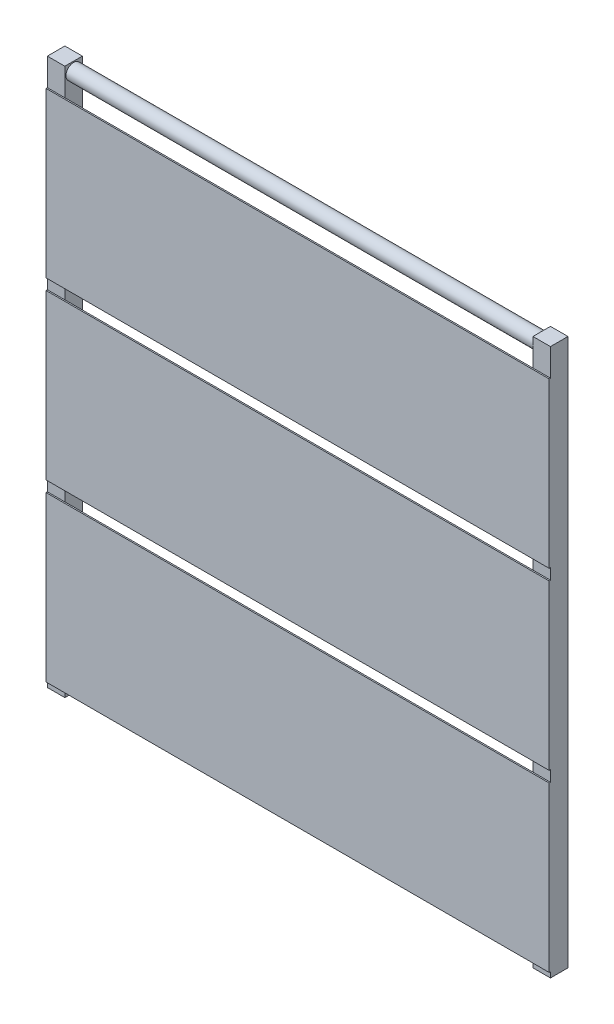
ISO-10303-21;
HEADER;
FILE_DESCRIPTION(('STEP AP214'),'2;1');
FILE_NAME('part.step','',(''),(''),'','','');
FILE_SCHEMA(('AUTOMOTIVE_DESIGN { 1 0 10303 214 1 1 1 1 }'));
ENDSEC;
DATA;
#1=APPLICATION_CONTEXT('core data for automotive mechanical design processes');
#2=APPLICATION_PROTOCOL_DEFINITION('international standard','automotive_design',2000,#1);
#3=PRODUCT_CONTEXT('',#1,'mechanical');
#4=PRODUCT('Part','Part','',(#3));
#5=PRODUCT_RELATED_PRODUCT_CATEGORY('part','',(#4));
#6=PRODUCT_DEFINITION_FORMATION('','',#4);
#7=PRODUCT_DEFINITION_CONTEXT('part definition',#1,'design');
#8=PRODUCT_DEFINITION('design','',#6,#7);
#9=PRODUCT_DEFINITION_SHAPE('','',#8);
#10=(LENGTH_UNIT() NAMED_UNIT(*) SI_UNIT(.MILLI.,.METRE.));
#11=(NAMED_UNIT(*) PLANE_ANGLE_UNIT() SI_UNIT($,.RADIAN.));
#12=(NAMED_UNIT(*) SI_UNIT($,.STERADIAN.) SOLID_ANGLE_UNIT());
#13=UNCERTAINTY_MEASURE_WITH_UNIT(LENGTH_MEASURE(1.E-05),#10,'distance_accuracy_value','');
#14=(GEOMETRIC_REPRESENTATION_CONTEXT(3) GLOBAL_UNCERTAINTY_ASSIGNED_CONTEXT((#13)) GLOBAL_UNIT_ASSIGNED_CONTEXT((#10,
#11,#12)) REPRESENTATION_CONTEXT('',''));
#15=CARTESIAN_POINT('',(0.,0.,0.));
#16=DIRECTION('',(0.,0.,1.));
#17=DIRECTION('',(1.,0.,0.));
#18=AXIS2_PLACEMENT_3D('',#15,#16,#17);
#19=CARTESIAN_POINT('',(-230.,250.,9.70000000000003));
#20=DIRECTION('',(0.,0.,-1.));
#21=DIRECTION('',(-1.,0.,0.));
#22=AXIS2_PLACEMENT_3D('',#19,#20,#21);
#23=PLANE('',#22);
#24=DIRECTION('',(1.,0.,0.));
#25=VECTOR('',#24,1.);
#26=CARTESIAN_POINT('',(-229.999999999997,-245.,9.70000000000003));
#27=LINE('',#26,#25);
#28=CARTESIAN_POINT('',(-229.999999999997,-245.,9.70000000000003));
#29=VERTEX_POINT('',#28);
#30=CARTESIAN_POINT('',(-214.,-245.,9.70000000000003));
#31=VERTEX_POINT('',#30);
#32=EDGE_CURVE('E577',#29,#31,#27,.T.);
#33=ORIENTED_EDGE('',*,*,#32,.F.);
#34=DIRECTION('',(0.,-1.,0.));
#35=VECTOR('',#34,1.);
#36=CARTESIAN_POINT('',(-230.,250.,9.70000000000003));
#37=LINE('',#36,#35);
#38=CARTESIAN_POINT('',(-230.,-250.,9.70000000000003));
#39=VERTEX_POINT('',#38);
#40=EDGE_CURVE('E417',#29,#39,#37,.T.);
#41=ORIENTED_EDGE('',*,*,#40,.T.);
#42=DIRECTION('',(1.,0.,0.));
#43=VECTOR('',#42,1.);
#44=CARTESIAN_POINT('',(-230.,-250.,9.70000000000003));
#45=LINE('',#44,#43);
#46=CARTESIAN_POINT('',(-214.,-250.,9.70000000000003));
#47=VERTEX_POINT('',#46);
#48=EDGE_CURVE('E392',#39,#47,#45,.T.);
#49=ORIENTED_EDGE('',*,*,#48,.T.);
#50=DIRECTION('',(0.,-1.,0.));
#51=VECTOR('',#50,1.);
#52=CARTESIAN_POINT('',(-214.,250.,9.70000000000003));
#53=LINE('',#52,#51);
#54=EDGE_CURVE('E55',#31,#47,#53,.T.);
#55=ORIENTED_EDGE('',*,*,#54,.F.);
#56=EDGE_LOOP('',(#33,#41,#49,#55));
#57=FACE_BOUND('',#56,.T.);
#58=ADVANCED_FACE('F39',(#57),#23,.F.);
#59=DIRECTION('',(-1.,0.,0.));
#60=VECTOR('',#59,1.);
#61=CARTESIAN_POINT('',(-229.999999999997,-95.,9.70000000000003));
#62=LINE('',#61,#60);
#63=CARTESIAN_POINT('',(-214.,-95.,9.70000000000003));
#64=VERTEX_POINT('',#63);
#65=CARTESIAN_POINT('',(-230.,-95.,9.70000000000003));
#66=VERTEX_POINT('',#65);
#67=EDGE_CURVE('E63',#64,#66,#62,.T.);
#68=ORIENTED_EDGE('',*,*,#67,.F.);
#69=CARTESIAN_POINT('',(-214.,-85.,9.70000000000003));
#70=VERTEX_POINT('',#69);
#71=EDGE_CURVE('E527',#70,#64,#53,.T.);
#72=ORIENTED_EDGE('',*,*,#71,.F.);
#73=DIRECTION('',(1.,0.,0.));
#74=VECTOR('',#73,1.);
#75=CARTESIAN_POINT('',(-229.999999999998,-85.,9.70000000000003));
#76=LINE('',#75,#74);
#77=CARTESIAN_POINT('',(-229.999999999998,-85.,9.70000000000003));
#78=VERTEX_POINT('',#77);
#79=EDGE_CURVE('E271',#78,#70,#76,.T.);
#80=ORIENTED_EDGE('',*,*,#79,.F.);
#81=EDGE_CURVE('E535',#78,#66,#37,.T.);
#82=ORIENTED_EDGE('',*,*,#81,.T.);
#83=EDGE_LOOP('',(#68,#72,#80,#82));
#84=FACE_BOUND('',#83,.T.);
#85=ADVANCED_FACE('F595',(#84),#23,.F.);
#86=CARTESIAN_POINT('',(230.,250.,9.69999999999992));
#87=DIRECTION('',(0.,0.,-1.));
#88=DIRECTION('',(-1.,0.,0.));
#89=AXIS2_PLACEMENT_3D('',#86,#87,#88);
#90=PLANE('',#89);
#91=CARTESIAN_POINT('',(214.,-245.,9.70000000000003));
#92=VERTEX_POINT('',#91);
#93=CARTESIAN_POINT('',(230.,-245.,9.69999999999992));
#94=VERTEX_POINT('',#93);
#95=EDGE_CURVE('E244',#92,#94,#27,.T.);
#96=ORIENTED_EDGE('',*,*,#95,.F.);
#97=DIRECTION('',(0.,-1.,0.));
#98=VECTOR('',#97,1.);
#99=CARTESIAN_POINT('',(214.,250.,9.69999999999992));
#100=LINE('',#99,#98);
#101=CARTESIAN_POINT('',(214.,-250.,9.69999999999992));
#102=VERTEX_POINT('',#101);
#103=EDGE_CURVE('E333',#92,#102,#100,.T.);
#104=ORIENTED_EDGE('',*,*,#103,.T.);
#105=DIRECTION('',(1.,0.,0.));
#106=VECTOR('',#105,1.);
#107=CARTESIAN_POINT('',(230.,-250.,9.69999999999992));
#108=LINE('',#107,#106);
#109=CARTESIAN_POINT('',(230.,-250.,9.69999999999992));
#110=VERTEX_POINT('',#109);
#111=EDGE_CURVE('E306',#102,#110,#108,.T.);
#112=ORIENTED_EDGE('',*,*,#111,.T.);
#113=DIRECTION('',(0.,-1.,0.));
#114=VECTOR('',#113,1.);
#115=CARTESIAN_POINT('',(230.,250.,9.69999999999992));
#116=LINE('',#115,#114);
#117=EDGE_CURVE('E315',#94,#110,#116,.T.);
#118=ORIENTED_EDGE('',*,*,#117,.F.);
#119=EDGE_LOOP('',(#96,#104,#112,#118));
#120=FACE_BOUND('',#119,.T.);
#121=ADVANCED_FACE('F454',(#120),#90,.F.);
#122=CARTESIAN_POINT('',(230.,-95.,9.69999999999992));
#123=VERTEX_POINT('',#122);
#124=CARTESIAN_POINT('',(214.,-95.,9.69999999999992));
#125=VERTEX_POINT('',#124);
#126=EDGE_CURVE('E237',#123,#125,#62,.T.);
#127=ORIENTED_EDGE('',*,*,#126,.F.);
#128=CARTESIAN_POINT('',(230.,-85.,9.69999999999992));
#129=VERTEX_POINT('',#128);
#130=EDGE_CURVE('E495',#129,#123,#116,.T.);
#131=ORIENTED_EDGE('',*,*,#130,.F.);
#132=CARTESIAN_POINT('',(214.,-85.,9.70000000000003));
#133=VERTEX_POINT('',#132);
#134=EDGE_CURVE('E250',#133,#129,#76,.T.);
#135=ORIENTED_EDGE('',*,*,#134,.F.);
#136=EDGE_CURVE('E459',#133,#125,#100,.T.);
#137=ORIENTED_EDGE('',*,*,#136,.T.);
#138=EDGE_LOOP('',(#127,#131,#135,#137));
#139=FACE_BOUND('',#138,.T.);
#140=ADVANCED_FACE('F566',(#139),#90,.F.);
#141=DIRECTION('',(-1.,0.,0.));
#142=VECTOR('',#141,1.);
#143=CARTESIAN_POINT('',(-229.999999999998,65.,9.70000000000003));
#144=LINE('',#143,#142);
#145=CARTESIAN_POINT('',(-214.,65.,9.70000000000003));
#146=VERTEX_POINT('',#145);
#147=CARTESIAN_POINT('',(-230.,65.,9.70000000000003));
#148=VERTEX_POINT('',#147);
#149=EDGE_CURVE('E275',#146,#148,#144,.T.);
#150=ORIENTED_EDGE('',*,*,#149,.F.);
#151=CARTESIAN_POINT('',(-214.,75.,9.70000000000003));
#152=VERTEX_POINT('',#151);
#153=EDGE_CURVE('E529',#152,#146,#53,.T.);
#154=ORIENTED_EDGE('',*,*,#153,.F.);
#155=DIRECTION('',(1.,0.,0.));
#156=VECTOR('',#155,1.);
#157=CARTESIAN_POINT('',(-230.,75.,9.70000000000003));
#158=LINE('',#157,#156);
#159=CARTESIAN_POINT('',(-230.,75.,9.70000000000003));
#160=VERTEX_POINT('',#159);
#161=EDGE_CURVE('E354',#160,#152,#158,.T.);
#162=ORIENTED_EDGE('',*,*,#161,.F.);
#163=EDGE_CURVE('E423',#160,#148,#37,.T.);
#164=ORIENTED_EDGE('',*,*,#163,.T.);
#165=EDGE_LOOP('',(#150,#154,#162,#164));
#166=FACE_BOUND('',#165,.T.);
#167=ADVANCED_FACE('F553',(#166),#23,.F.);
#168=CARTESIAN_POINT('',(230.,65.,9.69999999999992));
#169=VERTEX_POINT('',#168);
#170=CARTESIAN_POINT('',(214.,65.,9.69999999999992));
#171=VERTEX_POINT('',#170);
#172=EDGE_CURVE('E261',#169,#171,#144,.T.);
#173=ORIENTED_EDGE('',*,*,#172,.F.);
#174=CARTESIAN_POINT('',(230.,75.,9.70000000000003));
#175=VERTEX_POINT('',#174);
#176=EDGE_CURVE('E334',#175,#169,#116,.T.);
#177=ORIENTED_EDGE('',*,*,#176,.F.);
#178=CARTESIAN_POINT('',(214.,75.,9.70000000000003));
#179=VERTEX_POINT('',#178);
#180=EDGE_CURVE('E367',#179,#175,#158,.T.);
#181=ORIENTED_EDGE('',*,*,#180,.F.);
#182=EDGE_CURVE('E340',#179,#171,#100,.T.);
#183=ORIENTED_EDGE('',*,*,#182,.T.);
#184=EDGE_LOOP('',(#173,#177,#181,#183));
#185=FACE_BOUND('',#184,.T.);
#186=ADVANCED_FACE('F479',(#185),#90,.F.);
#187=CARTESIAN_POINT('',(0.,0.,9.70000000000003));
#188=DIRECTION('',(0.,0.,1.));
#189=DIRECTION('',(1.,0.,0.));
#190=AXIS2_PLACEMENT_3D('',#187,#188,#189);
#191=PLANE('',#190);
#192=DIRECTION('',(0.,1.,0.));
#193=VECTOR('',#192,1.);
#194=CARTESIAN_POINT('',(214.,0.,9.70000000000003));
#195=LINE('',#194,#193);
#196=CARTESIAN_POINT('',(214.,225.,9.69999999999992));
#197=VERTEX_POINT('',#196);
#198=EDGE_CURVE('E431',#179,#197,#195,.T.);
#199=ORIENTED_EDGE('',*,*,#198,.F.);
#200=EDGE_CURVE('E372',#152,#179,#158,.T.);
#201=ORIENTED_EDGE('',*,*,#200,.F.);
#202=CARTESIAN_POINT('',(-214.,225.,9.70000000000003));
#203=VERTEX_POINT('',#202);
#204=EDGE_CURVE('E418',#203,#152,#53,.T.);
#205=ORIENTED_EDGE('',*,*,#204,.F.);
#206=DIRECTION('',(-1.,0.,0.));
#207=VECTOR('',#206,1.);
#208=CARTESIAN_POINT('',(-230.,225.,9.70000000000003));
#209=LINE('',#208,#207);
#210=EDGE_CURVE('E348',#197,#203,#209,.T.);
#211=ORIENTED_EDGE('',*,*,#210,.F.);
#212=EDGE_LOOP('',(#199,#201,#205,#211));
#213=FACE_BOUND('',#212,.T.);
#214=ADVANCED_FACE('F550',(#213),#191,.F.);
#215=CARTESIAN_POINT('',(-230.,225.,9.70000000000003));
#216=VERTEX_POINT('',#215);
#217=EDGE_CURVE('E368',#203,#216,#209,.T.);
#218=ORIENTED_EDGE('',*,*,#217,.F.);
#219=CARTESIAN_POINT('',(-214.,250.,9.70000000000003));
#220=VERTEX_POINT('',#219);
#221=EDGE_CURVE('E413',#220,#203,#53,.T.);
#222=ORIENTED_EDGE('',*,*,#221,.F.);
#223=DIRECTION('',(1.,0.,0.));
#224=VECTOR('',#223,1.);
#225=CARTESIAN_POINT('',(-230.,250.,9.70000000000003));
#226=LINE('',#225,#224);
#227=CARTESIAN_POINT('',(-230.,250.,9.70000000000003));
#228=VERTEX_POINT('',#227);
#229=EDGE_CURVE('E398',#228,#220,#226,.T.);
#230=ORIENTED_EDGE('',*,*,#229,.F.);
#231=EDGE_CURVE('E419',#228,#216,#37,.T.);
#232=ORIENTED_EDGE('',*,*,#231,.T.);
#233=EDGE_LOOP('',(#218,#222,#230,#232));
#234=FACE_BOUND('',#233,.T.);
#235=ADVANCED_FACE('F544',(#234),#23,.F.);
#236=CARTESIAN_POINT('',(-214.,250.,9.70000000000003));
#237=DIRECTION('',(-1.,0.,0.));
#238=DIRECTION('',(0.,0.,1.));
#239=AXIS2_PLACEMENT_3D('',#236,#237,#238);
#240=PLANE('',#239);
#241=CARTESIAN_POINT('',(-214.,242.,1.69999999999992));
#242=DIRECTION('',(-1.,0.,0.));
#243=DIRECTION('',(0.,0.,1.));
#244=AXIS2_PLACEMENT_3D('',#241,#242,#243);
#245=CIRCLE('',#244,7.);
#246=CARTESIAN_POINT('',(-214.,242.,8.69999999999992));
#247=VERTEX_POINT('',#246);
#248=EDGE_CURVE('E11',#247,#247,#245,.F.);
#249=ORIENTED_EDGE('',*,*,#248,.F.);
#250=EDGE_LOOP('',(#249));
#251=FACE_BOUND('',#250,.T.);
#252=DIRECTION('',(0.,0.,-1.));
#253=VECTOR('',#252,1.);
#254=CARTESIAN_POINT('',(-214.,-250.,9.70000000000003));
#255=LINE('',#254,#253);
#256=CARTESIAN_POINT('',(-214.,-250.,-6.29999999999997));
#257=VERTEX_POINT('',#256);
#258=EDGE_CURVE('E386',#47,#257,#255,.T.);
#259=ORIENTED_EDGE('',*,*,#258,.T.);
#260=DIRECTION('',(0.,-1.,0.));
#261=VECTOR('',#260,1.);
#262=CARTESIAN_POINT('',(-214.,250.,-6.29999999999997));
#263=LINE('',#262,#261);
#264=CARTESIAN_POINT('',(-214.,250.,-6.29999999999997));
#265=VERTEX_POINT('',#264);
#266=EDGE_CURVE('E427',#265,#257,#263,.T.);
#267=ORIENTED_EDGE('',*,*,#266,.F.);
#268=DIRECTION('',(0.,0.,-1.));
#269=VECTOR('',#268,1.);
#270=CARTESIAN_POINT('',(-214.,250.,9.70000000000003));
#271=LINE('',#270,#269);
#272=EDGE_CURVE('E387',#220,#265,#271,.T.);
#273=ORIENTED_EDGE('',*,*,#272,.F.);
#274=ORIENTED_EDGE('',*,*,#221,.T.);
#275=ORIENTED_EDGE('',*,*,#204,.T.);
#276=ORIENTED_EDGE('',*,*,#153,.T.);
#277=DIRECTION('',(0.,-1.,0.));
#278=VECTOR('',#277,1.);
#279=CARTESIAN_POINT('',(-214.,250.,9.70000000000003));
#280=LINE('',#279,#278);
#281=EDGE_CURVE('E296',#146,#70,#280,.T.);
#282=ORIENTED_EDGE('',*,*,#281,.T.);
#283=ORIENTED_EDGE('',*,*,#71,.T.);
#284=DIRECTION('',(0.,-1.,0.));
#285=VECTOR('',#284,1.);
#286=CARTESIAN_POINT('',(-214.,250.,9.70000000000003));
#287=LINE('',#286,#285);
#288=EDGE_CURVE('E246',#64,#31,#287,.T.);
#289=ORIENTED_EDGE('',*,*,#288,.T.);
#290=ORIENTED_EDGE('',*,*,#54,.T.);
#291=EDGE_LOOP('',(#259,#267,#273,#274,#275,#276,#282,#283,#289,#290));
#292=FACE_BOUND('',#291,.T.);
#293=ADVANCED_FACE('F41',(#251,#292),#240,.F.);
#294=CARTESIAN_POINT('',(-230.,250.,-6.29999999999997));
#295=DIRECTION('',(0.,0.,1.));
#296=DIRECTION('',(1.,0.,0.));
#297=AXIS2_PLACEMENT_3D('',#294,#295,#296);
#298=PLANE('',#297);
#299=DIRECTION('',(-1.,0.,0.));
#300=VECTOR('',#299,1.);
#301=CARTESIAN_POINT('',(-230.,-250.,-6.29999999999997));
#302=LINE('',#301,#300);
#303=CARTESIAN_POINT('',(-230.,-250.,-6.29999999999997));
#304=VERTEX_POINT('',#303);
#305=EDGE_CURVE('E404',#257,#304,#302,.T.);
#306=ORIENTED_EDGE('',*,*,#305,.T.);
#307=DIRECTION('',(0.,-1.,0.));
#308=VECTOR('',#307,1.);
#309=CARTESIAN_POINT('',(-230.,250.,-6.29999999999997));
#310=LINE('',#309,#308);
#311=CARTESIAN_POINT('',(-230.,250.,-6.29999999999997));
#312=VERTEX_POINT('',#311);
#313=EDGE_CURVE('E422',#312,#304,#310,.T.);
#314=ORIENTED_EDGE('',*,*,#313,.F.);
#315=DIRECTION('',(-1.,0.,0.));
#316=VECTOR('',#315,1.);
#317=CARTESIAN_POINT('',(-230.,250.,-6.29999999999997));
#318=LINE('',#317,#316);
#319=EDGE_CURVE('E391',#265,#312,#318,.T.);
#320=ORIENTED_EDGE('',*,*,#319,.F.);
#321=ORIENTED_EDGE('',*,*,#266,.T.);
#322=EDGE_LOOP('',(#306,#314,#320,#321));
#323=FACE_BOUND('',#322,.T.);
#324=ADVANCED_FACE('F607',(#323),#298,.F.);
#325=CARTESIAN_POINT('',(-230.,250.,9.70000000000003));
#326=DIRECTION('',(1.,0.,0.));
#327=DIRECTION('',(0.,0.,-1.));
#328=AXIS2_PLACEMENT_3D('',#325,#326,#327);
#329=PLANE('',#328);
#330=DIRECTION('',(0.,0.,1.));
#331=VECTOR('',#330,1.);
#332=CARTESIAN_POINT('',(-230.,-250.,9.70000000000003));
#333=LINE('',#332,#331);
#334=EDGE_CURVE('E407',#304,#39,#333,.T.);
#335=ORIENTED_EDGE('',*,*,#334,.T.);
#336=ORIENTED_EDGE('',*,*,#40,.F.);
#337=DIRECTION('',(0.,0.,-1.));
#338=VECTOR('',#337,1.);
#339=CARTESIAN_POINT('',(-229.999999999997,-245.,10.9));
#340=LINE('',#339,#338);
#341=CARTESIAN_POINT('',(-229.999999999997,-245.,10.9));
#342=VERTEX_POINT('',#341);
#343=EDGE_CURVE('E587',#342,#29,#340,.T.);
#344=ORIENTED_EDGE('',*,*,#343,.F.);
#345=DIRECTION('',(0.,-1.,0.));
#346=VECTOR('',#345,1.);
#347=CARTESIAN_POINT('',(-229.999999999997,-95.,10.9));
#348=LINE('',#347,#346);
#349=CARTESIAN_POINT('',(-229.999999999997,-95.,10.9));
#350=VERTEX_POINT('',#349);
#351=EDGE_CURVE('E232',#350,#342,#348,.T.);
#352=ORIENTED_EDGE('',*,*,#351,.F.);
#353=DIRECTION('',(0.,0.,-1.));
#354=VECTOR('',#353,1.);
#355=CARTESIAN_POINT('',(-229.999999999997,-95.,10.9));
#356=LINE('',#355,#354);
#357=EDGE_CURVE('E252',#350,#66,#356,.T.);
#358=ORIENTED_EDGE('',*,*,#357,.T.);
#359=ORIENTED_EDGE('',*,*,#81,.F.);
#360=DIRECTION('',(0.,0.,-1.));
#361=VECTOR('',#360,1.);
#362=CARTESIAN_POINT('',(-229.999999999998,-85.,10.9));
#363=LINE('',#362,#361);
#364=CARTESIAN_POINT('',(-229.999999999998,-85.,10.9));
#365=VERTEX_POINT('',#364);
#366=EDGE_CURVE('E270',#365,#78,#363,.T.);
#367=ORIENTED_EDGE('',*,*,#366,.F.);
#368=DIRECTION('',(0.,-1.,0.));
#369=VECTOR('',#368,1.);
#370=CARTESIAN_POINT('',(-229.999999999998,65.,10.9));
#371=LINE('',#370,#369);
#372=CARTESIAN_POINT('',(-229.999999999998,65.,10.9));
#373=VERTEX_POINT('',#372);
#374=EDGE_CURVE('E267',#373,#365,#371,.T.);
#375=ORIENTED_EDGE('',*,*,#374,.F.);
#376=DIRECTION('',(0.,0.,-1.));
#377=VECTOR('',#376,1.);
#378=CARTESIAN_POINT('',(-229.999999999998,65.,10.9));
#379=LINE('',#378,#377);
#380=EDGE_CURVE('E284',#373,#148,#379,.T.);
#381=ORIENTED_EDGE('',*,*,#380,.T.);
#382=ORIENTED_EDGE('',*,*,#163,.F.);
#383=DIRECTION('',(0.,0.,-1.));
#384=VECTOR('',#383,1.);
#385=CARTESIAN_POINT('',(-230.,75.,10.9));
#386=LINE('',#385,#384);
#387=CARTESIAN_POINT('',(-230.,75.,10.9));
#388=VERTEX_POINT('',#387);
#389=EDGE_CURVE('E375',#388,#160,#386,.T.);
#390=ORIENTED_EDGE('',*,*,#389,.F.);
#391=DIRECTION('',(0.,-1.,0.));
#392=VECTOR('',#391,1.);
#393=CARTESIAN_POINT('',(-230.,225.,10.9));
#394=LINE('',#393,#392);
#395=CARTESIAN_POINT('',(-230.,225.,10.9));
#396=VERTEX_POINT('',#395);
#397=EDGE_CURVE('E357',#396,#388,#394,.T.);
#398=ORIENTED_EDGE('',*,*,#397,.F.);
#399=DIRECTION('',(0.,0.,-1.));
#400=VECTOR('',#399,1.);
#401=CARTESIAN_POINT('',(-230.,225.,10.9));
#402=LINE('',#401,#400);
#403=EDGE_CURVE('E379',#396,#216,#402,.T.);
#404=ORIENTED_EDGE('',*,*,#403,.T.);
#405=ORIENTED_EDGE('',*,*,#231,.F.);
#406=DIRECTION('',(0.,0.,1.));
#407=VECTOR('',#406,1.);
#408=CARTESIAN_POINT('',(-230.,250.,9.70000000000003));
#409=LINE('',#408,#407);
#410=EDGE_CURVE('E395',#312,#228,#409,.T.);
#411=ORIENTED_EDGE('',*,*,#410,.F.);
#412=ORIENTED_EDGE('',*,*,#313,.T.);
#413=EDGE_LOOP('',(#335,#336,#344,#352,#358,#359,#367,#375,#381,#382,#390,#398,#404,#405,#411,#412));
#414=FACE_BOUND('',#413,.T.);
#415=ADVANCED_FACE('F555',(#414),#329,.F.);
#416=CARTESIAN_POINT('',(0.,250.,0.));
#417=DIRECTION('',(0.,-1.,0.));
#418=DIRECTION('',(0.,0.,-1.));
#419=AXIS2_PLACEMENT_3D('',#416,#417,#418);
#420=PLANE('',#419);
#421=ORIENTED_EDGE('',*,*,#272,.T.);
#422=ORIENTED_EDGE('',*,*,#319,.T.);
#423=ORIENTED_EDGE('',*,*,#410,.T.);
#424=ORIENTED_EDGE('',*,*,#229,.T.);
#425=EDGE_LOOP('',(#421,#422,#423,#424));
#426=FACE_BOUND('',#425,.T.);
#427=ADVANCED_FACE('F634',(#426),#420,.F.);
#428=CARTESIAN_POINT('',(0.,-250.,0.));
#429=DIRECTION('',(0.,-1.,0.));
#430=DIRECTION('',(0.,0.,-1.));
#431=AXIS2_PLACEMENT_3D('',#428,#429,#430);
#432=PLANE('',#431);
#433=ORIENTED_EDGE('',*,*,#258,.F.);
#434=ORIENTED_EDGE('',*,*,#48,.F.);
#435=ORIENTED_EDGE('',*,*,#334,.F.);
#436=ORIENTED_EDGE('',*,*,#305,.F.);
#437=EDGE_LOOP('',(#433,#434,#435,#436));
#438=FACE_BOUND('',#437,.T.);
#439=ADVANCED_FACE('F633',(#438),#432,.T.);
#440=CARTESIAN_POINT('',(230.,225.,10.9));
#441=DIRECTION('',(-1.,0.,0.));
#442=DIRECTION('',(0.,0.,1.));
#443=AXIS2_PLACEMENT_3D('',#440,#441,#442);
#444=PLANE('',#443);
#445=DIRECTION('',(0.,0.,-1.));
#446=VECTOR('',#445,1.);
#447=CARTESIAN_POINT('',(230.,75.,10.9));
#448=LINE('',#447,#446);
#449=CARTESIAN_POINT('',(230.,75.,10.9));
#450=VERTEX_POINT('',#449);
#451=EDGE_CURVE('E363',#450,#175,#448,.T.);
#452=ORIENTED_EDGE('',*,*,#451,.T.);
#453=ORIENTED_EDGE('',*,*,#176,.T.);
#454=DIRECTION('',(0.,0.,-1.));
#455=VECTOR('',#454,1.);
#456=CARTESIAN_POINT('',(230.000000000002,65.,10.9));
#457=LINE('',#456,#455);
#458=CARTESIAN_POINT('',(230.000000000002,65.,10.9));
#459=VERTEX_POINT('',#458);
#460=EDGE_CURVE('E288',#459,#169,#457,.T.);
#461=ORIENTED_EDGE('',*,*,#460,.F.);
#462=DIRECTION('',(0.,1.,0.));
#463=VECTOR('',#462,1.);
#464=CARTESIAN_POINT('',(230.000000000002,65.,10.9));
#465=LINE('',#464,#463);
#466=CARTESIAN_POINT('',(230.000000000002,-85.,10.9));
#467=VERTEX_POINT('',#466);
#468=EDGE_CURVE('E260',#467,#459,#465,.T.);
#469=ORIENTED_EDGE('',*,*,#468,.F.);
#470=DIRECTION('',(0.,0.,-1.));
#471=VECTOR('',#470,1.);
#472=CARTESIAN_POINT('',(230.000000000002,-85.,10.9));
#473=LINE('',#472,#471);
#474=EDGE_CURVE('E292',#467,#129,#473,.T.);
#475=ORIENTED_EDGE('',*,*,#474,.T.);
#476=ORIENTED_EDGE('',*,*,#130,.T.);
#477=DIRECTION('',(0.,0.,-1.));
#478=VECTOR('',#477,1.);
#479=CARTESIAN_POINT('',(230.000000000003,-95.,10.9));
#480=LINE('',#479,#478);
#481=CARTESIAN_POINT('',(230.000000000003,-95.,10.9));
#482=VERTEX_POINT('',#481);
#483=EDGE_CURVE('E222',#482,#123,#480,.T.);
#484=ORIENTED_EDGE('',*,*,#483,.F.);
#485=DIRECTION('',(0.,1.,0.));
#486=VECTOR('',#485,1.);
#487=CARTESIAN_POINT('',(230.000000000003,-95.,10.9));
#488=LINE('',#487,#486);
#489=CARTESIAN_POINT('',(230.000000000003,-245.,10.9));
#490=VERTEX_POINT('',#489);
#491=EDGE_CURVE('E214',#490,#482,#488,.T.);
#492=ORIENTED_EDGE('',*,*,#491,.F.);
#493=DIRECTION('',(0.,0.,-1.));
#494=VECTOR('',#493,1.);
#495=CARTESIAN_POINT('',(230.000000000003,-245.,10.9));
#496=LINE('',#495,#494);
#497=EDGE_CURVE('E219',#490,#94,#496,.T.);
#498=ORIENTED_EDGE('',*,*,#497,.T.);
#499=ORIENTED_EDGE('',*,*,#117,.T.);
#500=DIRECTION('',(0.,0.,-1.));
#501=VECTOR('',#500,1.);
#502=CARTESIAN_POINT('',(230.,-250.,9.69999999999992));
#503=LINE('',#502,#501);
#504=CARTESIAN_POINT('',(230.,-250.,-6.30000000000008));
#505=VERTEX_POINT('',#504);
#506=EDGE_CURVE('E300',#110,#505,#503,.T.);
#507=ORIENTED_EDGE('',*,*,#506,.T.);
#508=DIRECTION('',(0.,-1.,0.));
#509=VECTOR('',#508,1.);
#510=CARTESIAN_POINT('',(230.,250.,-6.30000000000008));
#511=LINE('',#510,#509);
#512=CARTESIAN_POINT('',(230.,250.,-6.30000000000008));
#513=VERTEX_POINT('',#512);
#514=EDGE_CURVE('E344',#513,#505,#511,.T.);
#515=ORIENTED_EDGE('',*,*,#514,.F.);
#516=DIRECTION('',(0.,0.,-1.));
#517=VECTOR('',#516,1.);
#518=CARTESIAN_POINT('',(230.,250.,9.69999999999992));
#519=LINE('',#518,#517);
#520=CARTESIAN_POINT('',(230.,250.,9.69999999999992));
#521=VERTEX_POINT('',#520);
#522=EDGE_CURVE('E301',#521,#513,#519,.T.);
#523=ORIENTED_EDGE('',*,*,#522,.F.);
#524=CARTESIAN_POINT('',(230.,225.,9.70000000000003));
#525=VERTEX_POINT('',#524);
#526=EDGE_CURVE('E329',#521,#525,#116,.T.);
#527=ORIENTED_EDGE('',*,*,#526,.T.);
#528=DIRECTION('',(0.,0.,-1.));
#529=VECTOR('',#528,1.);
#530=CARTESIAN_POINT('',(230.,225.,10.9));
#531=LINE('',#530,#529);
#532=CARTESIAN_POINT('',(230.,225.,10.9));
#533=VERTEX_POINT('',#532);
#534=EDGE_CURVE('E383',#533,#525,#531,.T.);
#535=ORIENTED_EDGE('',*,*,#534,.F.);
#536=DIRECTION('',(0.,1.,0.));
#537=VECTOR('',#536,1.);
#538=CARTESIAN_POINT('',(230.,225.,10.9));
#539=LINE('',#538,#537);
#540=EDGE_CURVE('E349',#450,#533,#539,.T.);
#541=ORIENTED_EDGE('',*,*,#540,.F.);
#542=EDGE_LOOP('',(#452,#453,#461,#469,#475,#476,#484,#492,#498,#499,#507,#515,#523,#527,#535,#541));
#543=FACE_BOUND('',#542,.T.);
#544=ADVANCED_FACE('F217',(#543),#444,.F.);
#545=CARTESIAN_POINT('',(-230.,225.,10.9));
#546=DIRECTION('',(0.,-1.,0.));
#547=DIRECTION('',(0.,0.,-1.));
#548=AXIS2_PLACEMENT_3D('',#545,#546,#547);
#549=PLANE('',#548);
#550=EDGE_CURVE('E364',#525,#197,#209,.T.);
#551=ORIENTED_EDGE('',*,*,#550,.T.);
#552=ORIENTED_EDGE('',*,*,#210,.T.);
#553=ORIENTED_EDGE('',*,*,#217,.T.);
#554=ORIENTED_EDGE('',*,*,#403,.F.);
#555=DIRECTION('',(-1.,0.,0.));
#556=VECTOR('',#555,1.);
#557=CARTESIAN_POINT('',(-230.,225.,10.9));
#558=LINE('',#557,#556);
#559=EDGE_CURVE('E353',#533,#396,#558,.T.);
#560=ORIENTED_EDGE('',*,*,#559,.F.);
#561=ORIENTED_EDGE('',*,*,#534,.T.);
#562=EDGE_LOOP('',(#551,#552,#553,#554,#560,#561));
#563=FACE_BOUND('',#562,.T.);
#564=ADVANCED_FACE('F510',(#563),#549,.F.);
#565=CARTESIAN_POINT('',(-230.,75.,10.9));
#566=DIRECTION('',(0.,1.,0.));
#567=DIRECTION('',(0.,0.,1.));
#568=AXIS2_PLACEMENT_3D('',#565,#566,#567);
#569=PLANE('',#568);
#570=ORIENTED_EDGE('',*,*,#161,.T.);
#571=ORIENTED_EDGE('',*,*,#200,.T.);
#572=ORIENTED_EDGE('',*,*,#180,.T.);
#573=ORIENTED_EDGE('',*,*,#451,.F.);
#574=DIRECTION('',(1.,0.,0.));
#575=VECTOR('',#574,1.);
#576=CARTESIAN_POINT('',(-230.,75.,10.9));
#577=LINE('',#576,#575);
#578=EDGE_CURVE('E360',#388,#450,#577,.T.);
#579=ORIENTED_EDGE('',*,*,#578,.F.);
#580=ORIENTED_EDGE('',*,*,#389,.T.);
#581=EDGE_LOOP('',(#570,#571,#572,#573,#579,#580));
#582=FACE_BOUND('',#581,.T.);
#583=ADVANCED_FACE('F520',(#582),#569,.F.);
#584=CARTESIAN_POINT('',(0.,0.,10.9));
#585=DIRECTION('',(0.,0.,1.));
#586=DIRECTION('',(1.,0.,0.));
#587=AXIS2_PLACEMENT_3D('',#584,#585,#586);
#588=PLANE('',#587);
#589=ORIENTED_EDGE('',*,*,#540,.T.);
#590=ORIENTED_EDGE('',*,*,#559,.T.);
#591=ORIENTED_EDGE('',*,*,#397,.T.);
#592=ORIENTED_EDGE('',*,*,#578,.T.);
#593=EDGE_LOOP('',(#589,#590,#591,#592));
#594=FACE_BOUND('',#593,.T.);
#595=ADVANCED_FACE('F516',(#594),#588,.T.);
#596=CARTESIAN_POINT('',(214.,250.,9.69999999999992));
#597=VERTEX_POINT('',#596);
#598=EDGE_CURVE('E335',#597,#197,#100,.T.);
#599=ORIENTED_EDGE('',*,*,#598,.T.);
#600=ORIENTED_EDGE('',*,*,#550,.F.);
#601=ORIENTED_EDGE('',*,*,#526,.F.);
#602=DIRECTION('',(1.,0.,0.));
#603=VECTOR('',#602,1.);
#604=CARTESIAN_POINT('',(230.,250.,9.69999999999992));
#605=LINE('',#604,#603);
#606=EDGE_CURVE('E312',#597,#521,#605,.T.);
#607=ORIENTED_EDGE('',*,*,#606,.F.);
#608=EDGE_LOOP('',(#599,#600,#601,#607));
#609=FACE_BOUND('',#608,.T.);
#610=ADVANCED_FACE('F507',(#609),#90,.F.);
#611=CARTESIAN_POINT('',(230.,250.,-6.30000000000008));
#612=DIRECTION('',(0.,0.,1.));
#613=DIRECTION('',(1.,0.,0.));
#614=AXIS2_PLACEMENT_3D('',#611,#612,#613);
#615=PLANE('',#614);
#616=DIRECTION('',(-1.,0.,0.));
#617=VECTOR('',#616,1.);
#618=CARTESIAN_POINT('',(230.,-250.,-6.30000000000008));
#619=LINE('',#618,#617);
#620=CARTESIAN_POINT('',(214.,-250.,-6.30000000000008));
#621=VERTEX_POINT('',#620);
#622=EDGE_CURVE('E319',#505,#621,#619,.T.);
#623=ORIENTED_EDGE('',*,*,#622,.T.);
#624=DIRECTION('',(0.,-1.,0.));
#625=VECTOR('',#624,1.);
#626=CARTESIAN_POINT('',(214.,250.,-6.30000000000008));
#627=LINE('',#626,#625);
#628=CARTESIAN_POINT('',(214.,250.,-6.30000000000008));
#629=VERTEX_POINT('',#628);
#630=EDGE_CURVE('E339',#629,#621,#627,.T.);
#631=ORIENTED_EDGE('',*,*,#630,.F.);
#632=DIRECTION('',(-1.,0.,0.));
#633=VECTOR('',#632,1.);
#634=CARTESIAN_POINT('',(230.,250.,-6.30000000000008));
#635=LINE('',#634,#633);
#636=EDGE_CURVE('E305',#513,#629,#635,.T.);
#637=ORIENTED_EDGE('',*,*,#636,.F.);
#638=ORIENTED_EDGE('',*,*,#514,.T.);
#639=EDGE_LOOP('',(#623,#631,#637,#638));
#640=FACE_BOUND('',#639,.T.);
#641=ADVANCED_FACE('F444',(#640),#615,.F.);
#642=CARTESIAN_POINT('',(214.,250.,9.69999999999992));
#643=DIRECTION('',(1.,0.,0.));
#644=DIRECTION('',(0.,0.,-1.));
#645=AXIS2_PLACEMENT_3D('',#642,#643,#644);
#646=PLANE('',#645);
#647=CARTESIAN_POINT('',(214.,242.,1.69999999999992));
#648=DIRECTION('',(1.,0.,0.));
#649=DIRECTION('',(0.,0.,-1.));
#650=AXIS2_PLACEMENT_3D('',#647,#648,#649);
#651=CIRCLE('',#650,7.);
#652=CARTESIAN_POINT('',(214.,242.,8.69999999999992));
#653=VERTEX_POINT('',#652);
#654=EDGE_CURVE('E48',#653,#653,#651,.F.);
#655=ORIENTED_EDGE('',*,*,#654,.F.);
#656=EDGE_LOOP('',(#655));
#657=FACE_BOUND('',#656,.T.);
#658=DIRECTION('',(0.,0.,1.));
#659=VECTOR('',#658,1.);
#660=CARTESIAN_POINT('',(214.,-250.,9.69999999999992));
#661=LINE('',#660,#659);
#662=EDGE_CURVE('E322',#621,#102,#661,.T.);
#663=ORIENTED_EDGE('',*,*,#662,.T.);
#664=ORIENTED_EDGE('',*,*,#103,.F.);
#665=EDGE_CURVE('E457',#125,#92,#100,.T.);
#666=ORIENTED_EDGE('',*,*,#665,.F.);
#667=ORIENTED_EDGE('',*,*,#136,.F.);
#668=EDGE_CURVE('E465',#171,#133,#100,.T.);
#669=ORIENTED_EDGE('',*,*,#668,.F.);
#670=ORIENTED_EDGE('',*,*,#182,.F.);
#671=ORIENTED_EDGE('',*,*,#198,.T.);
#672=ORIENTED_EDGE('',*,*,#598,.F.);
#673=DIRECTION('',(0.,0.,1.));
#674=VECTOR('',#673,1.);
#675=CARTESIAN_POINT('',(214.,250.,9.69999999999992));
#676=LINE('',#675,#674);
#677=EDGE_CURVE('E309',#629,#597,#676,.T.);
#678=ORIENTED_EDGE('',*,*,#677,.F.);
#679=ORIENTED_EDGE('',*,*,#630,.T.);
#680=EDGE_LOOP('',(#663,#664,#666,#667,#669,#670,#671,#672,#678,#679));
#681=FACE_BOUND('',#680,.T.);
#682=ADVANCED_FACE('F440',(#657,#681),#646,.F.);
#683=CARTESIAN_POINT('',(0.,250.,0.));
#684=DIRECTION('',(0.,1.,0.));
#685=DIRECTION('',(0.,0.,1.));
#686=AXIS2_PLACEMENT_3D('',#683,#684,#685);
#687=PLANE('',#686);
#688=ORIENTED_EDGE('',*,*,#522,.T.);
#689=ORIENTED_EDGE('',*,*,#636,.T.);
#690=ORIENTED_EDGE('',*,*,#677,.T.);
#691=ORIENTED_EDGE('',*,*,#606,.T.);
#692=EDGE_LOOP('',(#688,#689,#690,#691));
#693=FACE_BOUND('',#692,.T.);
#694=ADVANCED_FACE('F443',(#693),#687,.T.);
#695=CARTESIAN_POINT('',(0.,-250.,0.));
#696=DIRECTION('',(0.,1.,0.));
#697=DIRECTION('',(0.,0.,1.));
#698=AXIS2_PLACEMENT_3D('',#695,#696,#697);
#699=PLANE('',#698);
#700=ORIENTED_EDGE('',*,*,#506,.F.);
#701=ORIENTED_EDGE('',*,*,#111,.F.);
#702=ORIENTED_EDGE('',*,*,#662,.F.);
#703=ORIENTED_EDGE('',*,*,#622,.F.);
#704=EDGE_LOOP('',(#700,#701,#702,#703));
#705=FACE_BOUND('',#704,.T.);
#706=ADVANCED_FACE('F452',(#705),#699,.F.);
#707=CARTESIAN_POINT('',(0.,0.,9.70000000000003));
#708=DIRECTION('',(0.,0.,-1.));
#709=DIRECTION('',(-1.,0.,0.));
#710=AXIS2_PLACEMENT_3D('',#707,#708,#709);
#711=PLANE('',#710);
#712=ORIENTED_EDGE('',*,*,#281,.F.);
#713=EDGE_CURVE('E280',#171,#146,#144,.T.);
#714=ORIENTED_EDGE('',*,*,#713,.F.);
#715=ORIENTED_EDGE('',*,*,#668,.T.);
#716=EDGE_CURVE('E276',#70,#133,#76,.T.);
#717=ORIENTED_EDGE('',*,*,#716,.F.);
#718=EDGE_LOOP('',(#712,#714,#715,#717));
#719=FACE_BOUND('',#718,.T.);
#720=ADVANCED_FACE('F484',(#719),#711,.T.);
#721=CARTESIAN_POINT('',(-229.999999999998,-85.,10.9));
#722=DIRECTION('',(0.,1.,0.));
#723=DIRECTION('',(0.,0.,1.));
#724=AXIS2_PLACEMENT_3D('',#721,#722,#723);
#725=PLANE('',#724);
#726=ORIENTED_EDGE('',*,*,#79,.T.);
#727=ORIENTED_EDGE('',*,*,#716,.T.);
#728=ORIENTED_EDGE('',*,*,#134,.T.);
#729=ORIENTED_EDGE('',*,*,#474,.F.);
#730=DIRECTION('',(1.,0.,0.));
#731=VECTOR('',#730,1.);
#732=CARTESIAN_POINT('',(-229.999999999998,-85.,10.9));
#733=LINE('',#732,#731);
#734=EDGE_CURVE('E256',#365,#467,#733,.T.);
#735=ORIENTED_EDGE('',*,*,#734,.F.);
#736=ORIENTED_EDGE('',*,*,#366,.T.);
#737=EDGE_LOOP('',(#726,#727,#728,#729,#735,#736));
#738=FACE_BOUND('',#737,.T.);
#739=ADVANCED_FACE('F564',(#738),#725,.F.);
#740=CARTESIAN_POINT('',(-229.999999999998,65.,10.9));
#741=DIRECTION('',(0.,-1.,0.));
#742=DIRECTION('',(0.,0.,-1.));
#743=AXIS2_PLACEMENT_3D('',#740,#741,#742);
#744=PLANE('',#743);
#745=ORIENTED_EDGE('',*,*,#172,.T.);
#746=ORIENTED_EDGE('',*,*,#713,.T.);
#747=ORIENTED_EDGE('',*,*,#149,.T.);
#748=ORIENTED_EDGE('',*,*,#380,.F.);
#749=DIRECTION('',(-1.,0.,0.));
#750=VECTOR('',#749,1.);
#751=CARTESIAN_POINT('',(-229.999999999998,65.,10.9));
#752=LINE('',#751,#750);
#753=EDGE_CURVE('E264',#459,#373,#752,.T.);
#754=ORIENTED_EDGE('',*,*,#753,.F.);
#755=ORIENTED_EDGE('',*,*,#460,.T.);
#756=EDGE_LOOP('',(#745,#746,#747,#748,#754,#755));
#757=FACE_BOUND('',#756,.T.);
#758=ADVANCED_FACE('F488',(#757),#744,.F.);
#759=CARTESIAN_POINT('',(0.,0.,10.9));
#760=DIRECTION('',(0.,0.,-1.));
#761=DIRECTION('',(-1.,0.,0.));
#762=AXIS2_PLACEMENT_3D('',#759,#760,#761);
#763=PLANE('',#762);
#764=ORIENTED_EDGE('',*,*,#734,.T.);
#765=ORIENTED_EDGE('',*,*,#468,.T.);
#766=ORIENTED_EDGE('',*,*,#753,.T.);
#767=ORIENTED_EDGE('',*,*,#374,.T.);
#768=EDGE_LOOP('',(#764,#765,#766,#767));
#769=FACE_BOUND('',#768,.T.);
#770=ADVANCED_FACE('F645',(#769),#763,.F.);
#771=CARTESIAN_POINT('',(0.,0.,9.70000000000003));
#772=DIRECTION('',(0.,0.,-1.));
#773=DIRECTION('',(-1.,0.,0.));
#774=AXIS2_PLACEMENT_3D('',#771,#772,#773);
#775=PLANE('',#774);
#776=ORIENTED_EDGE('',*,*,#288,.F.);
#777=EDGE_CURVE('E571',#125,#64,#62,.T.);
#778=ORIENTED_EDGE('',*,*,#777,.F.);
#779=ORIENTED_EDGE('',*,*,#665,.T.);
#780=EDGE_CURVE('E581',#31,#92,#27,.T.);
#781=ORIENTED_EDGE('',*,*,#780,.F.);
#782=EDGE_LOOP('',(#776,#778,#779,#781));
#783=FACE_BOUND('',#782,.T.);
#784=ADVANCED_FACE('F643',(#783),#775,.T.);
#785=CARTESIAN_POINT('',(-229.999999999997,-245.,10.9));
#786=DIRECTION('',(0.,1.,0.));
#787=DIRECTION('',(0.,0.,1.));
#788=AXIS2_PLACEMENT_3D('',#785,#786,#787);
#789=PLANE('',#788);
#790=ORIENTED_EDGE('',*,*,#32,.T.);
#791=ORIENTED_EDGE('',*,*,#780,.T.);
#792=ORIENTED_EDGE('',*,*,#95,.T.);
#793=ORIENTED_EDGE('',*,*,#497,.F.);
#794=DIRECTION('',(1.,0.,0.));
#795=VECTOR('',#794,1.);
#796=CARTESIAN_POINT('',(-229.999999999997,-245.,10.9));
#797=LINE('',#796,#795);
#798=EDGE_CURVE('E227',#342,#490,#797,.T.);
#799=ORIENTED_EDGE('',*,*,#798,.F.);
#800=ORIENTED_EDGE('',*,*,#343,.T.);
#801=EDGE_LOOP('',(#790,#791,#792,#793,#799,#800));
#802=FACE_BOUND('',#801,.T.);
#803=ADVANCED_FACE('F241',(#802),#789,.F.);
#804=CARTESIAN_POINT('',(-229.999999999997,-95.,10.9));
#805=DIRECTION('',(0.,-1.,0.));
#806=DIRECTION('',(0.,0.,-1.));
#807=AXIS2_PLACEMENT_3D('',#804,#805,#806);
#808=PLANE('',#807);
#809=ORIENTED_EDGE('',*,*,#126,.T.);
#810=ORIENTED_EDGE('',*,*,#777,.T.);
#811=ORIENTED_EDGE('',*,*,#67,.T.);
#812=ORIENTED_EDGE('',*,*,#357,.F.);
#813=DIRECTION('',(-1.,0.,0.));
#814=VECTOR('',#813,1.);
#815=CARTESIAN_POINT('',(-229.999999999997,-95.,10.9));
#816=LINE('',#815,#814);
#817=EDGE_CURVE('E226',#482,#350,#816,.T.);
#818=ORIENTED_EDGE('',*,*,#817,.F.);
#819=ORIENTED_EDGE('',*,*,#483,.T.);
#820=EDGE_LOOP('',(#809,#810,#811,#812,#818,#819));
#821=FACE_BOUND('',#820,.T.);
#822=ADVANCED_FACE('F589',(#821),#808,.F.);
#823=CARTESIAN_POINT('',(0.,0.,10.9));
#824=DIRECTION('',(0.,0.,-1.));
#825=DIRECTION('',(-1.,0.,0.));
#826=AXIS2_PLACEMENT_3D('',#823,#824,#825);
#827=PLANE('',#826);
#828=ORIENTED_EDGE('',*,*,#798,.T.);
#829=ORIENTED_EDGE('',*,*,#491,.T.);
#830=ORIENTED_EDGE('',*,*,#817,.T.);
#831=ORIENTED_EDGE('',*,*,#351,.T.);
#832=EDGE_LOOP('',(#828,#829,#830,#831));
#833=FACE_BOUND('',#832,.T.);
#834=ADVANCED_FACE('F230',(#833),#827,.F.);
#835=CARTESIAN_POINT('',(233.798989873223,242.,1.69999999999992));
#836=DIRECTION('',(-1.,0.,0.));
#837=DIRECTION('',(0.,0.,1.));
#838=AXIS2_PLACEMENT_3D('',#835,#836,#837);
#839=CYLINDRICAL_SURFACE('',#838,7.);
#840=CARTESIAN_POINT('',(-214.,242.,8.69999999999992));
#841=CARTESIAN_POINT('',(-209.541666666667,242.,8.69999999999992));
#842=CARTESIAN_POINT('',(-205.083333333333,242.,8.69999999999992));
#843=CARTESIAN_POINT('',(-196.166666666667,242.,8.69999999999992));
#844=CARTESIAN_POINT('',(-191.708333333333,242.,8.69999999999992));
#845=CARTESIAN_POINT('',(-182.791666666667,242.,8.69999999999992));
#846=CARTESIAN_POINT('',(-178.333333333333,242.,8.69999999999992));
#847=CARTESIAN_POINT('',(-169.416666666667,242.,8.69999999999992));
#848=CARTESIAN_POINT('',(-164.958333333333,242.,8.69999999999992));
#849=CARTESIAN_POINT('',(-156.041666666667,242.,8.69999999999992));
#850=CARTESIAN_POINT('',(-151.583333333333,242.,8.69999999999992));
#851=CARTESIAN_POINT('',(-142.666666666667,242.,8.69999999999992));
#852=CARTESIAN_POINT('',(-138.208333333333,242.,8.69999999999992));
#853=CARTESIAN_POINT('',(-129.291666666667,242.,8.69999999999992));
#854=CARTESIAN_POINT('',(-124.833333333333,242.,8.69999999999992));
#855=CARTESIAN_POINT('',(-115.916666666667,242.,8.69999999999992));
#856=CARTESIAN_POINT('',(-111.458333333333,242.,8.69999999999992));
#857=CARTESIAN_POINT('',(-102.541666666667,242.,8.69999999999992));
#858=CARTESIAN_POINT('',(-98.0833333333333,242.,8.69999999999992));
#859=CARTESIAN_POINT('',(-89.1666666666666,242.,8.69999999999992));
#860=CARTESIAN_POINT('',(-84.7083333333333,242.,8.69999999999992));
#861=CARTESIAN_POINT('',(-75.7916666666666,242.,8.69999999999992));
#862=CARTESIAN_POINT('',(-71.3333333333333,242.,8.69999999999992));
#863=CARTESIAN_POINT('',(-62.4166666666666,242.,8.69999999999992));
#864=CARTESIAN_POINT('',(-57.9583333333333,242.,8.69999999999992));
#865=CARTESIAN_POINT('',(-49.0416666666666,242.,8.69999999999992));
#866=CARTESIAN_POINT('',(-44.5833333333333,242.,8.69999999999992));
#867=CARTESIAN_POINT('',(-35.6666666666666,242.,8.69999999999992));
#868=CARTESIAN_POINT('',(-31.2083333333333,242.,8.69999999999992));
#869=CARTESIAN_POINT('',(-22.2916666666666,242.,8.69999999999992));
#870=CARTESIAN_POINT('',(-17.8333333333333,242.,8.69999999999992));
#871=CARTESIAN_POINT('',(-8.91666666666664,242.,8.69999999999992));
#872=CARTESIAN_POINT('',(-4.4583333333333,242.,8.69999999999992));
#873=CARTESIAN_POINT('',(4.45833333333336,242.,8.69999999999992));
#874=CARTESIAN_POINT('',(8.91666666666669,242.,8.69999999999992));
#875=CARTESIAN_POINT('',(17.8333333333334,242.,8.69999999999992));
#876=CARTESIAN_POINT('',(22.2916666666667,242.,8.69999999999992));
#877=CARTESIAN_POINT('',(31.2083333333334,242.,8.69999999999992));
#878=CARTESIAN_POINT('',(35.6666666666667,242.,8.69999999999992));
#879=CARTESIAN_POINT('',(44.5833333333334,242.,8.69999999999992));
#880=CARTESIAN_POINT('',(49.0416666666667,242.,8.69999999999992));
#881=CARTESIAN_POINT('',(57.9583333333334,242.,8.69999999999992));
#882=CARTESIAN_POINT('',(62.4166666666667,242.,8.69999999999992));
#883=CARTESIAN_POINT('',(71.3333333333334,242.,8.69999999999992));
#884=CARTESIAN_POINT('',(75.7916666666667,242.,8.69999999999992));
#885=CARTESIAN_POINT('',(84.7083333333334,242.,8.69999999999992));
#886=CARTESIAN_POINT('',(89.1666666666667,242.,8.69999999999992));
#887=CARTESIAN_POINT('',(98.0833333333334,242.,8.69999999999992));
#888=CARTESIAN_POINT('',(102.541666666667,242.,8.69999999999992));
#889=CARTESIAN_POINT('',(111.458333333333,242.,8.69999999999992));
#890=CARTESIAN_POINT('',(115.916666666667,242.,8.69999999999992));
#891=CARTESIAN_POINT('',(124.833333333333,242.,8.69999999999992));
#892=CARTESIAN_POINT('',(129.291666666667,242.,8.69999999999992));
#893=CARTESIAN_POINT('',(138.208333333333,242.,8.69999999999992));
#894=CARTESIAN_POINT('',(142.666666666667,242.,8.69999999999992));
#895=CARTESIAN_POINT('',(151.583333333333,242.,8.69999999999992));
#896=CARTESIAN_POINT('',(156.041666666667,242.,8.69999999999992));
#897=CARTESIAN_POINT('',(164.958333333333,242.,8.69999999999992));
#898=CARTESIAN_POINT('',(169.416666666667,242.,8.69999999999992));
#899=CARTESIAN_POINT('',(178.333333333333,242.,8.69999999999992));
#900=CARTESIAN_POINT('',(182.791666666667,242.,8.69999999999992));
#901=CARTESIAN_POINT('',(191.708333333333,242.,8.69999999999992));
#902=CARTESIAN_POINT('',(196.166666666667,242.,8.69999999999992));
#903=CARTESIAN_POINT('',(205.083333333333,242.,8.69999999999992));
#904=CARTESIAN_POINT('',(209.541666666667,242.,8.69999999999992));
#905=CARTESIAN_POINT('',(214.,242.,8.69999999999992));
#906=B_SPLINE_CURVE_WITH_KNOTS('',3,(#840,#841,#842,#843,#844,#845,#846,#847,#848,#849,#850,
#851,#852,#853,#854,#855,#856,#857,#858,#859,#860,#861,#862,#863,#864,#865,#866,#867,#868,#869,
#870,#871,#872,#873,#874,#875,#876,#877,#878,#879,#880,#881,#882,#883,#884,#885,#886,#887,#888,
#889,#890,#891,#892,#893,#894,#895,#896,#897,#898,#899,#900,#901,#902,#903,#904,#905),
.UNSPECIFIED.,.F.,.F.,(4,2,2,2,2,2,2,2,2,2,2,2,2,2,2,2,2,2,2,2,2,2,2,2,2,2,2,2,2,2,2,2,4),(0.,
13.375,26.75,40.125,53.5,66.875,80.25,93.625,107.,120.375,133.75,147.125,160.5,173.875,187.25,
200.625,214.,227.375,240.75,254.125,267.5,280.875,294.25,307.625,321.,334.375,347.75,361.125,
374.5,387.875,401.25,414.625,428.),.UNSPECIFIED.);
#907=EDGE_CURVE('BSEAM438',#247,#653,#906,.T.);
#908=ORIENTED_EDGE('',*,*,#248,.T.);
#909=ORIENTED_EDGE('',*,*,#654,.T.);
#910=ORIENTED_EDGE('',*,*,#907,.T.);
#911=ORIENTED_EDGE('',*,*,#907,.F.);
#912=EDGE_LOOP('',(#908,#910,#909,#911));
#913=FACE_BOUND('',#912,.T.);
#914=ADVANCED_FACE('F438',(#913),#839,.T.);
#915=CLOSED_SHELL('',(#58,#85,#121,#140,#167,#186,#214,#235,#293,#324,#415,#427,#439,#544,#564,
#583,#595,#610,#641,#682,#694,#706,#720,#739,#758,#770,#784,#803,#822,#834,#914));
#916=MANIFOLD_SOLID_BREP('B2',#915);
#917=ADVANCED_BREP_SHAPE_REPRESENTATION('',(#18,#916),#14);
#918=SHAPE_DEFINITION_REPRESENTATION(#9,#917);
ENDSEC;
END-ISO-10303-21;
